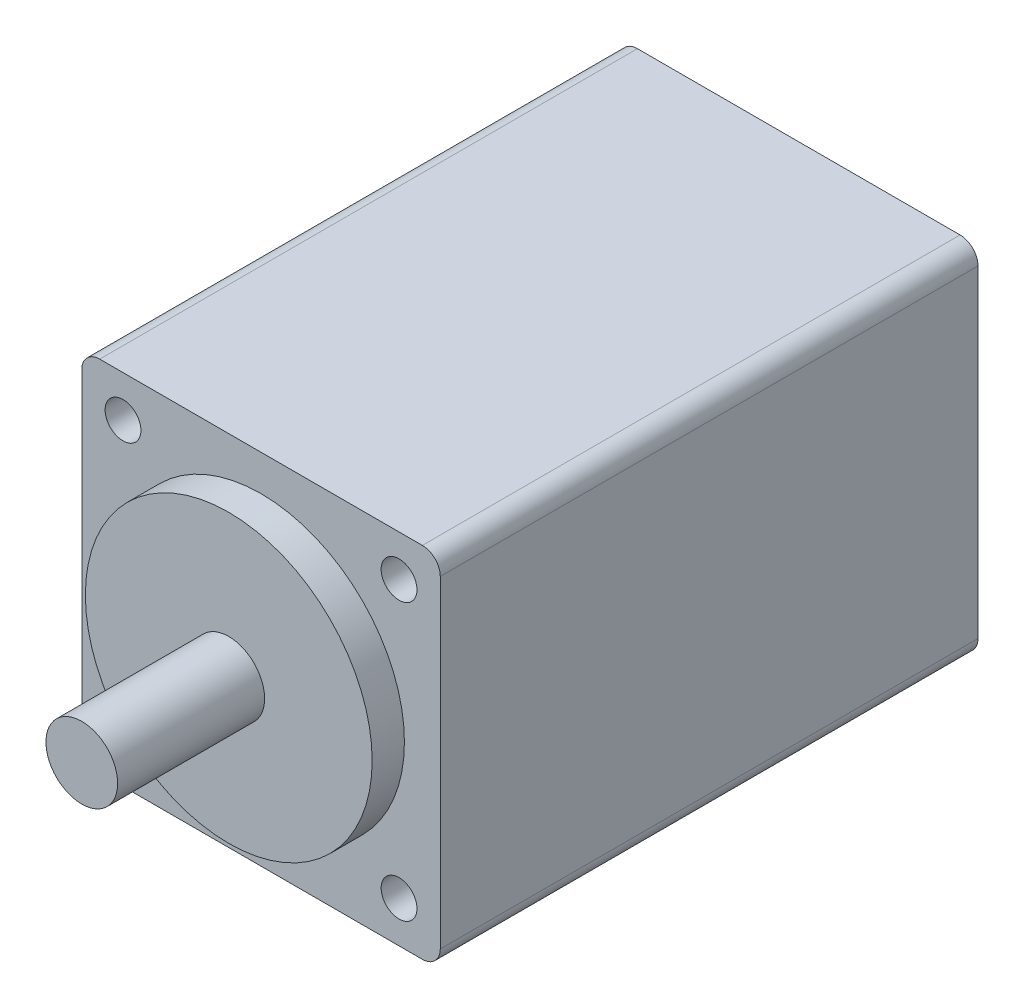
ISO-10303-21;
HEADER;
FILE_DESCRIPTION(('STEP AP214'),'2;1');
FILE_NAME('part.step','',(''),(''),'','','');
FILE_SCHEMA(('AUTOMOTIVE_DESIGN { 1 0 10303 214 1 1 1 1 }'));
ENDSEC;
DATA;
#1=APPLICATION_CONTEXT('core data for automotive mechanical design processes');
#2=APPLICATION_PROTOCOL_DEFINITION('international standard','automotive_design',2000,#1);
#3=PRODUCT_CONTEXT('',#1,'mechanical');
#4=PRODUCT('Part','Part','',(#3));
#5=PRODUCT_RELATED_PRODUCT_CATEGORY('part','',(#4));
#6=PRODUCT_DEFINITION_FORMATION('','',#4);
#7=PRODUCT_DEFINITION_CONTEXT('part definition',#1,'design');
#8=PRODUCT_DEFINITION('design','',#6,#7);
#9=PRODUCT_DEFINITION_SHAPE('','',#8);
#10=(LENGTH_UNIT() NAMED_UNIT(*) SI_UNIT(.MILLI.,.METRE.));
#11=(NAMED_UNIT(*) PLANE_ANGLE_UNIT() SI_UNIT($,.RADIAN.));
#12=(NAMED_UNIT(*) SI_UNIT($,.STERADIAN.) SOLID_ANGLE_UNIT());
#13=UNCERTAINTY_MEASURE_WITH_UNIT(LENGTH_MEASURE(1.E-05),#10,'distance_accuracy_value','');
#14=(GEOMETRIC_REPRESENTATION_CONTEXT(3) GLOBAL_UNCERTAINTY_ASSIGNED_CONTEXT((#13)) GLOBAL_UNIT_ASSIGNED_CONTEXT((#10,
#11,#12)) REPRESENTATION_CONTEXT('',''));
#15=CARTESIAN_POINT('',(0.,0.,0.));
#16=DIRECTION('',(0.,0.,1.));
#17=DIRECTION('',(1.,0.,0.));
#18=AXIS2_PLACEMENT_3D('',#15,#16,#17);
#19=CARTESIAN_POINT('',(10.,10.,30.));
#20=DIRECTION('',(-1.,0.,0.));
#21=DIRECTION('',(0.,-1.,0.));
#22=AXIS2_PLACEMENT_3D('',#19,#20,#21);
#23=PLANE('',#22);
#24=DIRECTION('',(0.,1.,0.));
#25=VECTOR('',#24,1.);
#26=CARTESIAN_POINT('',(10.,10.,30.));
#27=LINE('',#26,#25);
#28=CARTESIAN_POINT('',(10.,-9.,30.));
#29=VERTEX_POINT('',#28);
#30=CARTESIAN_POINT('',(10.,9.,30.));
#31=VERTEX_POINT('',#30);
#32=EDGE_CURVE('E131',#29,#31,#27,.T.);
#33=ORIENTED_EDGE('',*,*,#32,.F.);
#34=DIRECTION('',(0.,0.,-1.));
#35=VECTOR('',#34,1.);
#36=CARTESIAN_POINT('',(10.,-9.,30.));
#37=LINE('',#36,#35);
#38=CARTESIAN_POINT('',(10.,-9.,0.));
#39=VERTEX_POINT('',#38);
#40=EDGE_CURVE('E39',#29,#39,#37,.T.);
#41=ORIENTED_EDGE('',*,*,#40,.T.);
#42=DIRECTION('',(0.,1.,0.));
#43=VECTOR('',#42,1.);
#44=CARTESIAN_POINT('',(10.,10.,0.));
#45=LINE('',#44,#43);
#46=CARTESIAN_POINT('',(10.,9.,0.));
#47=VERTEX_POINT('',#46);
#48=EDGE_CURVE('E176',#39,#47,#45,.T.);
#49=ORIENTED_EDGE('',*,*,#48,.T.);
#50=DIRECTION('',(0.,0.,-1.));
#51=VECTOR('',#50,1.);
#52=CARTESIAN_POINT('',(10.,9.,30.));
#53=LINE('',#52,#51);
#54=EDGE_CURVE('E157',#47,#31,#53,.F.);
#55=ORIENTED_EDGE('',*,*,#54,.T.);
#56=EDGE_LOOP('',(#33,#41,#49,#55));
#57=FACE_BOUND('',#56,.T.);
#58=ADVANCED_FACE('F35',(#57),#23,.F.);
#59=CARTESIAN_POINT('',(-10.,10.,30.));
#60=DIRECTION('',(0.,-1.,0.));
#61=DIRECTION('',(0.,0.,-1.));
#62=AXIS2_PLACEMENT_3D('',#59,#60,#61);
#63=PLANE('',#62);
#64=DIRECTION('',(-1.,0.,0.));
#65=VECTOR('',#64,1.);
#66=CARTESIAN_POINT('',(-10.,10.,0.));
#67=LINE('',#66,#65);
#68=CARTESIAN_POINT('',(9.,10.,0.));
#69=VERTEX_POINT('',#68);
#70=CARTESIAN_POINT('',(-9.,10.,0.));
#71=VERTEX_POINT('',#70);
#72=EDGE_CURVE('E136',#69,#71,#67,.T.);
#73=ORIENTED_EDGE('',*,*,#72,.T.);
#74=DIRECTION('',(0.,0.,-1.));
#75=VECTOR('',#74,1.);
#76=CARTESIAN_POINT('',(-9.,10.,30.));
#77=LINE('',#76,#75);
#78=CARTESIAN_POINT('',(-9.,10.,30.));
#79=VERTEX_POINT('',#78);
#80=EDGE_CURVE('E52',#71,#79,#77,.F.);
#81=ORIENTED_EDGE('',*,*,#80,.T.);
#82=DIRECTION('',(-1.,0.,0.));
#83=VECTOR('',#82,1.);
#84=CARTESIAN_POINT('',(-10.,10.,30.));
#85=LINE('',#84,#83);
#86=CARTESIAN_POINT('',(9.,10.,30.));
#87=VERTEX_POINT('',#86);
#88=EDGE_CURVE('E134',#87,#79,#85,.T.);
#89=ORIENTED_EDGE('',*,*,#88,.F.);
#90=DIRECTION('',(0.,0.,-1.));
#91=VECTOR('',#90,1.);
#92=CARTESIAN_POINT('',(9.,10.,30.));
#93=LINE('',#92,#91);
#94=EDGE_CURVE('E154',#87,#69,#93,.T.);
#95=ORIENTED_EDGE('',*,*,#94,.T.);
#96=EDGE_LOOP('',(#73,#81,#89,#95));
#97=FACE_BOUND('',#96,.T.);
#98=ADVANCED_FACE('F178',(#97),#63,.F.);
#99=CARTESIAN_POINT('',(-10.,10.,30.));
#100=DIRECTION('',(1.,0.,0.));
#101=DIRECTION('',(0.,1.,0.));
#102=AXIS2_PLACEMENT_3D('',#99,#100,#101);
#103=PLANE('',#102);
#104=DIRECTION('',(0.,-1.,0.));
#105=VECTOR('',#104,1.);
#106=CARTESIAN_POINT('',(-10.,10.,0.));
#107=LINE('',#106,#105);
#108=CARTESIAN_POINT('',(-10.,9.,0.));
#109=VERTEX_POINT('',#108);
#110=CARTESIAN_POINT('',(-10.,-9.,0.));
#111=VERTEX_POINT('',#110);
#112=EDGE_CURVE('E132',#109,#111,#107,.T.);
#113=ORIENTED_EDGE('',*,*,#112,.T.);
#114=DIRECTION('',(0.,0.,-1.));
#115=VECTOR('',#114,1.);
#116=CARTESIAN_POINT('',(-10.,-9.,30.));
#117=LINE('',#116,#115);
#118=CARTESIAN_POINT('',(-10.,-9.,30.));
#119=VERTEX_POINT('',#118);
#120=EDGE_CURVE('E109',#111,#119,#117,.F.);
#121=ORIENTED_EDGE('',*,*,#120,.T.);
#122=DIRECTION('',(0.,-1.,0.));
#123=VECTOR('',#122,1.);
#124=CARTESIAN_POINT('',(-10.,10.,30.));
#125=LINE('',#124,#123);
#126=CARTESIAN_POINT('',(-10.,9.,30.));
#127=VERTEX_POINT('',#126);
#128=EDGE_CURVE('E172',#127,#119,#125,.T.);
#129=ORIENTED_EDGE('',*,*,#128,.F.);
#130=DIRECTION('',(0.,0.,-1.));
#131=VECTOR('',#130,1.);
#132=CARTESIAN_POINT('',(-10.,9.,30.));
#133=LINE('',#132,#131);
#134=EDGE_CURVE('E114',#127,#109,#133,.T.);
#135=ORIENTED_EDGE('',*,*,#134,.T.);
#136=EDGE_LOOP('',(#113,#121,#129,#135));
#137=FACE_BOUND('',#136,.T.);
#138=ADVANCED_FACE('F187',(#137),#103,.F.);
#139=CARTESIAN_POINT('',(-10.,-10.,30.));
#140=DIRECTION('',(0.,1.,0.));
#141=DIRECTION('',(0.,0.,1.));
#142=AXIS2_PLACEMENT_3D('',#139,#140,#141);
#143=PLANE('',#142);
#144=DIRECTION('',(1.,0.,0.));
#145=VECTOR('',#144,1.);
#146=CARTESIAN_POINT('',(-10.,-10.,30.));
#147=LINE('',#146,#145);
#148=CARTESIAN_POINT('',(-9.,-10.,30.));
#149=VERTEX_POINT('',#148);
#150=CARTESIAN_POINT('',(9.,-10.,30.));
#151=VERTEX_POINT('',#150);
#152=EDGE_CURVE('E124',#149,#151,#147,.T.);
#153=ORIENTED_EDGE('',*,*,#152,.F.);
#154=DIRECTION('',(0.,0.,-1.));
#155=VECTOR('',#154,1.);
#156=CARTESIAN_POINT('',(-9.,-10.,30.));
#157=LINE('',#156,#155);
#158=CARTESIAN_POINT('',(-9.,-10.,0.));
#159=VERTEX_POINT('',#158);
#160=EDGE_CURVE('E108',#149,#159,#157,.T.);
#161=ORIENTED_EDGE('',*,*,#160,.T.);
#162=DIRECTION('',(1.,0.,0.));
#163=VECTOR('',#162,1.);
#164=CARTESIAN_POINT('',(-10.,-10.,0.));
#165=LINE('',#164,#163);
#166=CARTESIAN_POINT('',(9.,-10.,0.));
#167=VERTEX_POINT('',#166);
#168=EDGE_CURVE('E121',#159,#167,#165,.T.);
#169=ORIENTED_EDGE('',*,*,#168,.T.);
#170=DIRECTION('',(0.,0.,-1.));
#171=VECTOR('',#170,1.);
#172=CARTESIAN_POINT('',(9.,-10.,30.));
#173=LINE('',#172,#171);
#174=EDGE_CURVE('E126',#167,#151,#173,.F.);
#175=ORIENTED_EDGE('',*,*,#174,.T.);
#176=EDGE_LOOP('',(#153,#161,#169,#175));
#177=FACE_BOUND('',#176,.T.);
#178=ADVANCED_FACE('F120',(#177),#143,.F.);
#179=CARTESIAN_POINT('',(0.,0.,30.));
#180=DIRECTION('',(0.,0.,1.));
#181=DIRECTION('',(1.,0.,0.));
#182=AXIS2_PLACEMENT_3D('',#179,#180,#181);
#183=PLANE('',#182);
#184=CARTESIAN_POINT('',(-7.7,-7.7,30.));
#185=DIRECTION('',(0.,0.,1.));
#186=DIRECTION('',(1.,0.,0.));
#187=AXIS2_PLACEMENT_3D('',#184,#185,#186);
#188=CIRCLE('',#187,1.);
#189=CARTESIAN_POINT('',(-6.7,-7.7,30.));
#190=VERTEX_POINT('',#189);
#191=EDGE_CURVE('E375',#190,#190,#188,.T.);
#192=ORIENTED_EDGE('',*,*,#191,.F.);
#193=EDGE_LOOP('',(#192));
#194=FACE_BOUND('',#193,.T.);
#195=CARTESIAN_POINT('',(7.7,-7.7,30.));
#196=DIRECTION('',(0.,0.,1.));
#197=DIRECTION('',(1.,0.,0.));
#198=AXIS2_PLACEMENT_3D('',#195,#196,#197);
#199=CIRCLE('',#198,1.);
#200=CARTESIAN_POINT('',(8.7,-7.7,30.));
#201=VERTEX_POINT('',#200);
#202=EDGE_CURVE('E374',#201,#201,#199,.T.);
#203=ORIENTED_EDGE('',*,*,#202,.F.);
#204=EDGE_LOOP('',(#203));
#205=FACE_BOUND('',#204,.T.);
#206=CARTESIAN_POINT('',(7.7,7.7,30.));
#207=DIRECTION('',(0.,0.,1.));
#208=DIRECTION('',(1.,0.,0.));
#209=AXIS2_PLACEMENT_3D('',#206,#207,#208);
#210=CIRCLE('',#209,1.);
#211=CARTESIAN_POINT('',(8.7,7.7,30.));
#212=VERTEX_POINT('',#211);
#213=EDGE_CURVE('E401',#212,#212,#210,.T.);
#214=ORIENTED_EDGE('',*,*,#213,.F.);
#215=EDGE_LOOP('',(#214));
#216=FACE_BOUND('',#215,.T.);
#217=CARTESIAN_POINT('',(-7.7,7.7,30.));
#218=DIRECTION('',(0.,0.,1.));
#219=DIRECTION('',(1.,0.,0.));
#220=AXIS2_PLACEMENT_3D('',#217,#218,#219);
#221=CIRCLE('',#220,1.);
#222=CARTESIAN_POINT('',(-6.7,7.7,30.));
#223=VERTEX_POINT('',#222);
#224=EDGE_CURVE('E388',#223,#223,#221,.T.);
#225=ORIENTED_EDGE('',*,*,#224,.F.);
#226=EDGE_LOOP('',(#225));
#227=FACE_BOUND('',#226,.T.);
#228=CARTESIAN_POINT('',(0.,0.,30.));
#229=DIRECTION('',(0.,0.,1.));
#230=DIRECTION('',(1.,0.,0.));
#231=AXIS2_PLACEMENT_3D('',#228,#229,#230);
#232=CIRCLE('',#231,8.);
#233=CARTESIAN_POINT('',(8.,0.,30.));
#234=VERTEX_POINT('',#233);
#235=EDGE_CURVE('E44',#234,#234,#232,.T.);
#236=ORIENTED_EDGE('',*,*,#235,.F.);
#237=EDGE_LOOP('',(#236));
#238=FACE_BOUND('',#237,.T.);
#239=ORIENTED_EDGE('',*,*,#128,.T.);
#240=CARTESIAN_POINT('',(-9.,-9.,30.));
#241=DIRECTION('',(0.,0.,1.));
#242=DIRECTION('',(1.,0.,0.));
#243=AXIS2_PLACEMENT_3D('',#240,#241,#242);
#244=CIRCLE('',#243,1.);
#245=EDGE_CURVE('E152',#119,#149,#244,.T.);
#246=ORIENTED_EDGE('',*,*,#245,.T.);
#247=ORIENTED_EDGE('',*,*,#152,.T.);
#248=CARTESIAN_POINT('',(9.,-9.,30.));
#249=DIRECTION('',(0.,0.,1.));
#250=DIRECTION('',(1.,0.,0.));
#251=AXIS2_PLACEMENT_3D('',#248,#249,#250);
#252=CIRCLE('',#251,1.);
#253=EDGE_CURVE('E148',#151,#29,#252,.T.);
#254=ORIENTED_EDGE('',*,*,#253,.T.);
#255=ORIENTED_EDGE('',*,*,#32,.T.);
#256=CARTESIAN_POINT('',(9.,9.,30.));
#257=DIRECTION('',(0.,0.,1.));
#258=DIRECTION('',(1.,0.,0.));
#259=AXIS2_PLACEMENT_3D('',#256,#257,#258);
#260=CIRCLE('',#259,1.);
#261=EDGE_CURVE('E59',#31,#87,#260,.T.);
#262=ORIENTED_EDGE('',*,*,#261,.T.);
#263=ORIENTED_EDGE('',*,*,#88,.T.);
#264=CARTESIAN_POINT('',(-9.,9.,30.));
#265=DIRECTION('',(0.,0.,1.));
#266=DIRECTION('',(1.,0.,0.));
#267=AXIS2_PLACEMENT_3D('',#264,#265,#266);
#268=CIRCLE('',#267,1.);
#269=EDGE_CURVE('E150',#79,#127,#268,.T.);
#270=ORIENTED_EDGE('',*,*,#269,.T.);
#271=EDGE_LOOP('',(#239,#246,#247,#254,#255,#262,#263,#270));
#272=FACE_BOUND('',#271,.T.);
#273=ADVANCED_FACE('F185',(#194,#205,#216,#227,#238,#272),#183,.T.);
#274=CARTESIAN_POINT('',(0.,0.,0.));
#275=DIRECTION('',(0.,0.,1.));
#276=DIRECTION('',(1.,0.,0.));
#277=AXIS2_PLACEMENT_3D('',#274,#275,#276);
#278=PLANE('',#277);
#279=ORIENTED_EDGE('',*,*,#168,.F.);
#280=CARTESIAN_POINT('',(-9.,-9.,0.));
#281=DIRECTION('',(0.,0.,1.));
#282=DIRECTION('',(1.,0.,0.));
#283=AXIS2_PLACEMENT_3D('',#280,#281,#282);
#284=CIRCLE('',#283,1.);
#285=EDGE_CURVE('E104',#159,#111,#284,.F.);
#286=ORIENTED_EDGE('',*,*,#285,.T.);
#287=ORIENTED_EDGE('',*,*,#112,.F.);
#288=CARTESIAN_POINT('',(-9.,9.,0.));
#289=DIRECTION('',(0.,0.,1.));
#290=DIRECTION('',(1.,0.,0.));
#291=AXIS2_PLACEMENT_3D('',#288,#289,#290);
#292=CIRCLE('',#291,1.);
#293=EDGE_CURVE('E115',#109,#71,#292,.F.);
#294=ORIENTED_EDGE('',*,*,#293,.T.);
#295=ORIENTED_EDGE('',*,*,#72,.F.);
#296=CARTESIAN_POINT('',(9.,9.,0.));
#297=DIRECTION('',(0.,0.,1.));
#298=DIRECTION('',(1.,0.,0.));
#299=AXIS2_PLACEMENT_3D('',#296,#297,#298);
#300=CIRCLE('',#299,1.);
#301=EDGE_CURVE('E125',#69,#47,#300,.F.);
#302=ORIENTED_EDGE('',*,*,#301,.T.);
#303=ORIENTED_EDGE('',*,*,#48,.F.);
#304=CARTESIAN_POINT('',(9.,-9.,0.));
#305=DIRECTION('',(0.,0.,1.));
#306=DIRECTION('',(1.,0.,0.));
#307=AXIS2_PLACEMENT_3D('',#304,#305,#306);
#308=CIRCLE('',#307,1.);
#309=EDGE_CURVE('E130',#39,#167,#308,.F.);
#310=ORIENTED_EDGE('',*,*,#309,.T.);
#311=EDGE_LOOP('',(#279,#286,#287,#294,#295,#302,#303,#310));
#312=FACE_BOUND('',#311,.T.);
#313=ADVANCED_FACE('F128',(#312),#278,.F.);
#314=CARTESIAN_POINT('',(-9.,-9.,30.));
#315=DIRECTION('',(0.,0.,-1.));
#316=DIRECTION('',(-1.,0.,0.));
#317=AXIS2_PLACEMENT_3D('',#314,#315,#316);
#318=CYLINDRICAL_SURFACE('',#317,1.);
#319=ORIENTED_EDGE('',*,*,#245,.F.);
#320=ORIENTED_EDGE('',*,*,#120,.F.);
#321=ORIENTED_EDGE('',*,*,#285,.F.);
#322=ORIENTED_EDGE('',*,*,#160,.F.);
#323=EDGE_LOOP('',(#319,#320,#321,#322));
#324=FACE_BOUND('',#323,.T.);
#325=ADVANCED_FACE('F107',(#324),#318,.T.);
#326=CARTESIAN_POINT('',(-9.,9.,30.));
#327=DIRECTION('',(0.,0.,-1.));
#328=DIRECTION('',(-1.,0.,0.));
#329=AXIS2_PLACEMENT_3D('',#326,#327,#328);
#330=CYLINDRICAL_SURFACE('',#329,1.);
#331=ORIENTED_EDGE('',*,*,#269,.F.);
#332=ORIENTED_EDGE('',*,*,#80,.F.);
#333=ORIENTED_EDGE('',*,*,#293,.F.);
#334=ORIENTED_EDGE('',*,*,#134,.F.);
#335=EDGE_LOOP('',(#331,#332,#333,#334));
#336=FACE_BOUND('',#335,.T.);
#337=ADVANCED_FACE('F182',(#336),#330,.T.);
#338=CARTESIAN_POINT('',(9.,-9.,30.));
#339=DIRECTION('',(0.,0.,-1.));
#340=DIRECTION('',(-1.,0.,0.));
#341=AXIS2_PLACEMENT_3D('',#338,#339,#340);
#342=CYLINDRICAL_SURFACE('',#341,1.);
#343=ORIENTED_EDGE('',*,*,#253,.F.);
#344=ORIENTED_EDGE('',*,*,#174,.F.);
#345=ORIENTED_EDGE('',*,*,#309,.F.);
#346=ORIENTED_EDGE('',*,*,#40,.F.);
#347=EDGE_LOOP('',(#343,#344,#345,#346));
#348=FACE_BOUND('',#347,.T.);
#349=ADVANCED_FACE('F204',(#348),#342,.T.);
#350=CARTESIAN_POINT('',(9.,9.,30.));
#351=DIRECTION('',(0.,0.,-1.));
#352=DIRECTION('',(-1.,0.,0.));
#353=AXIS2_PLACEMENT_3D('',#350,#351,#352);
#354=CYLINDRICAL_SURFACE('',#353,1.);
#355=ORIENTED_EDGE('',*,*,#261,.F.);
#356=ORIENTED_EDGE('',*,*,#54,.F.);
#357=ORIENTED_EDGE('',*,*,#301,.F.);
#358=ORIENTED_EDGE('',*,*,#94,.F.);
#359=EDGE_LOOP('',(#355,#356,#357,#358));
#360=FACE_BOUND('',#359,.T.);
#361=ADVANCED_FACE('F37',(#360),#354,.T.);
#362=CARTESIAN_POINT('',(0.,0.,31.8));
#363=DIRECTION('',(0.,0.,-1.));
#364=DIRECTION('',(-1.,0.,0.));
#365=AXIS2_PLACEMENT_3D('',#362,#363,#364);
#366=CYLINDRICAL_SURFACE('',#365,8.);
#367=CARTESIAN_POINT('',(0.,0.,31.8));
#368=DIRECTION('',(0.,0.,1.));
#369=DIRECTION('',(1.,0.,0.));
#370=AXIS2_PLACEMENT_3D('',#367,#368,#369);
#371=CIRCLE('',#370,8.);
#372=CARTESIAN_POINT('',(8.,0.,31.8));
#373=VERTEX_POINT('',#372);
#374=EDGE_CURVE('E169',#373,#373,#371,.T.);
#375=ORIENTED_EDGE('',*,*,#374,.F.);
#376=EDGE_LOOP('',(#375));
#377=FACE_BOUND('',#376,.T.);
#378=ORIENTED_EDGE('',*,*,#235,.T.);
#379=EDGE_LOOP('',(#378));
#380=FACE_BOUND('',#379,.T.);
#381=ADVANCED_FACE('F210',(#377,#380),#366,.T.);
#382=CARTESIAN_POINT('',(0.,0.,31.8));
#383=DIRECTION('',(0.,0.,1.));
#384=DIRECTION('',(1.,0.,0.));
#385=AXIS2_PLACEMENT_3D('',#382,#383,#384);
#386=PLANE('',#385);
#387=CARTESIAN_POINT('',(0.,0.,31.8));
#388=DIRECTION('',(0.,0.,1.));
#389=DIRECTION('',(1.,0.,0.));
#390=AXIS2_PLACEMENT_3D('',#387,#388,#389);
#391=CIRCLE('',#390,2.);
#392=CARTESIAN_POINT('',(2.,0.,31.8));
#393=VERTEX_POINT('',#392);
#394=EDGE_CURVE('E11',#393,#393,#391,.T.);
#395=ORIENTED_EDGE('',*,*,#394,.F.);
#396=EDGE_LOOP('',(#395));
#397=FACE_BOUND('',#396,.T.);
#398=ORIENTED_EDGE('',*,*,#374,.T.);
#399=EDGE_LOOP('',(#398));
#400=FACE_BOUND('',#399,.T.);
#401=ADVANCED_FACE('F216',(#397,#400),#386,.T.);
#402=CARTESIAN_POINT('',(0.,0.,40.));
#403=DIRECTION('',(0.,0.,-1.));
#404=DIRECTION('',(-1.,0.,0.));
#405=AXIS2_PLACEMENT_3D('',#402,#403,#404);
#406=CYLINDRICAL_SURFACE('',#405,2.);
#407=CARTESIAN_POINT('',(0.,0.,40.));
#408=DIRECTION('',(0.,0.,1.));
#409=DIRECTION('',(1.,0.,0.));
#410=AXIS2_PLACEMENT_3D('',#407,#408,#409);
#411=CIRCLE('',#410,2.);
#412=CARTESIAN_POINT('',(2.,0.,40.));
#413=VERTEX_POINT('',#412);
#414=EDGE_CURVE('E387',#413,#413,#411,.T.);
#415=ORIENTED_EDGE('',*,*,#414,.F.);
#416=EDGE_LOOP('',(#415));
#417=FACE_BOUND('',#416,.T.);
#418=ORIENTED_EDGE('',*,*,#394,.T.);
#419=EDGE_LOOP('',(#418));
#420=FACE_BOUND('',#419,.T.);
#421=ADVANCED_FACE('F222',(#417,#420),#406,.T.);
#422=CARTESIAN_POINT('',(0.,0.,40.));
#423=DIRECTION('',(0.,0.,1.));
#424=DIRECTION('',(1.,0.,0.));
#425=AXIS2_PLACEMENT_3D('',#422,#423,#424);
#426=PLANE('',#425);
#427=ORIENTED_EDGE('',*,*,#414,.T.);
#428=EDGE_LOOP('',(#427));
#429=FACE_BOUND('',#428,.T.);
#430=ADVANCED_FACE('F273',(#429),#426,.T.);
#431=CARTESIAN_POINT('',(-7.7,7.7,27.));
#432=DIRECTION('',(0.,0.,1.));
#433=DIRECTION('',(1.,0.,0.));
#434=AXIS2_PLACEMENT_3D('',#431,#432,#433);
#435=CYLINDRICAL_SURFACE('',#434,1.);
#436=CARTESIAN_POINT('',(-7.7,7.7,27.));
#437=DIRECTION('',(0.,0.,1.));
#438=DIRECTION('',(1.,0.,0.));
#439=AXIS2_PLACEMENT_3D('',#436,#437,#438);
#440=CIRCLE('',#439,1.);
#441=CARTESIAN_POINT('',(-6.7,7.7,27.));
#442=VERTEX_POINT('',#441);
#443=EDGE_CURVE('E384',#442,#442,#440,.T.);
#444=ORIENTED_EDGE('',*,*,#443,.F.);
#445=EDGE_LOOP('',(#444));
#446=FACE_BOUND('',#445,.T.);
#447=ORIENTED_EDGE('',*,*,#224,.T.);
#448=EDGE_LOOP('',(#447));
#449=FACE_BOUND('',#448,.T.);
#450=ADVANCED_FACE('F281',(#446,#449),#435,.F.);
#451=CARTESIAN_POINT('',(-7.7,7.7,27.));
#452=DIRECTION('',(0.,0.,1.));
#453=DIRECTION('',(1.,0.,0.));
#454=AXIS2_PLACEMENT_3D('',#451,#452,#453);
#455=PLANE('',#454);
#456=ORIENTED_EDGE('',*,*,#443,.T.);
#457=EDGE_LOOP('',(#456));
#458=FACE_BOUND('',#457,.T.);
#459=ADVANCED_FACE('F297',(#458),#455,.T.);
#460=CARTESIAN_POINT('',(7.7,7.7,27.));
#461=DIRECTION('',(0.,0.,1.));
#462=DIRECTION('',(1.,0.,0.));
#463=AXIS2_PLACEMENT_3D('',#460,#461,#462);
#464=CYLINDRICAL_SURFACE('',#463,1.);
#465=CARTESIAN_POINT('',(7.7,7.7,27.));
#466=DIRECTION('',(0.,0.,1.));
#467=DIRECTION('',(1.,0.,0.));
#468=AXIS2_PLACEMENT_3D('',#465,#466,#467);
#469=CIRCLE('',#468,1.);
#470=CARTESIAN_POINT('',(8.7,7.7,27.));
#471=VERTEX_POINT('',#470);
#472=EDGE_CURVE('E391',#471,#471,#469,.T.);
#473=ORIENTED_EDGE('',*,*,#472,.F.);
#474=EDGE_LOOP('',(#473));
#475=FACE_BOUND('',#474,.T.);
#476=ORIENTED_EDGE('',*,*,#213,.T.);
#477=EDGE_LOOP('',(#476));
#478=FACE_BOUND('',#477,.T.);
#479=ADVANCED_FACE('F307',(#475,#478),#464,.F.);
#480=CARTESIAN_POINT('',(7.7,7.7,27.));
#481=DIRECTION('',(0.,0.,1.));
#482=DIRECTION('',(1.,0.,0.));
#483=AXIS2_PLACEMENT_3D('',#480,#481,#482);
#484=PLANE('',#483);
#485=ORIENTED_EDGE('',*,*,#472,.T.);
#486=EDGE_LOOP('',(#485));
#487=FACE_BOUND('',#486,.T.);
#488=ADVANCED_FACE('F317',(#487),#484,.T.);
#489=CARTESIAN_POINT('',(7.7,-7.7,27.));
#490=DIRECTION('',(0.,0.,1.));
#491=DIRECTION('',(1.,0.,0.));
#492=AXIS2_PLACEMENT_3D('',#489,#490,#491);
#493=CYLINDRICAL_SURFACE('',#492,1.);
#494=CARTESIAN_POINT('',(7.7,-7.7,27.));
#495=DIRECTION('',(0.,0.,1.));
#496=DIRECTION('',(1.,0.,0.));
#497=AXIS2_PLACEMENT_3D('',#494,#495,#496);
#498=CIRCLE('',#497,1.);
#499=CARTESIAN_POINT('',(8.7,-7.7,27.));
#500=VERTEX_POINT('',#499);
#501=EDGE_CURVE('E378',#500,#500,#498,.T.);
#502=ORIENTED_EDGE('',*,*,#501,.F.);
#503=EDGE_LOOP('',(#502));
#504=FACE_BOUND('',#503,.T.);
#505=ORIENTED_EDGE('',*,*,#202,.T.);
#506=EDGE_LOOP('',(#505));
#507=FACE_BOUND('',#506,.T.);
#508=ADVANCED_FACE('F327',(#504,#507),#493,.F.);
#509=CARTESIAN_POINT('',(7.7,-7.7,27.));
#510=DIRECTION('',(0.,0.,1.));
#511=DIRECTION('',(1.,0.,0.));
#512=AXIS2_PLACEMENT_3D('',#509,#510,#511);
#513=PLANE('',#512);
#514=ORIENTED_EDGE('',*,*,#501,.T.);
#515=EDGE_LOOP('',(#514));
#516=FACE_BOUND('',#515,.T.);
#517=ADVANCED_FACE('F337',(#516),#513,.T.);
#518=CARTESIAN_POINT('',(-7.7,-7.7,27.));
#519=DIRECTION('',(0.,0.,1.));
#520=DIRECTION('',(1.,0.,0.));
#521=AXIS2_PLACEMENT_3D('',#518,#519,#520);
#522=CYLINDRICAL_SURFACE('',#521,1.);
#523=CARTESIAN_POINT('',(-7.7,-7.7,27.));
#524=DIRECTION('',(0.,0.,1.));
#525=DIRECTION('',(1.,0.,0.));
#526=AXIS2_PLACEMENT_3D('',#523,#524,#525);
#527=CIRCLE('',#526,1.);
#528=CARTESIAN_POINT('',(-6.7,-7.7,27.));
#529=VERTEX_POINT('',#528);
#530=EDGE_CURVE('E373',#529,#529,#527,.T.);
#531=ORIENTED_EDGE('',*,*,#530,.F.);
#532=EDGE_LOOP('',(#531));
#533=FACE_BOUND('',#532,.T.);
#534=ORIENTED_EDGE('',*,*,#191,.T.);
#535=EDGE_LOOP('',(#534));
#536=FACE_BOUND('',#535,.T.);
#537=ADVANCED_FACE('F347',(#533,#536),#522,.F.);
#538=CARTESIAN_POINT('',(-7.7,-7.7,27.));
#539=DIRECTION('',(0.,0.,1.));
#540=DIRECTION('',(1.,0.,0.));
#541=AXIS2_PLACEMENT_3D('',#538,#539,#540);
#542=PLANE('',#541);
#543=ORIENTED_EDGE('',*,*,#530,.T.);
#544=EDGE_LOOP('',(#543));
#545=FACE_BOUND('',#544,.T.);
#546=ADVANCED_FACE('F357',(#545),#542,.T.);
#547=CLOSED_SHELL('',(#58,#98,#138,#178,#273,#313,#325,#337,#349,#361,#381,#401,#421,#430,#450,
#459,#479,#488,#508,#517,#537,#546));
#548=MANIFOLD_SOLID_BREP('B2',#547);
#549=ADVANCED_BREP_SHAPE_REPRESENTATION('',(#18,#548),#14);
#550=SHAPE_DEFINITION_REPRESENTATION(#9,#549);
ENDSEC;
END-ISO-10303-21;
